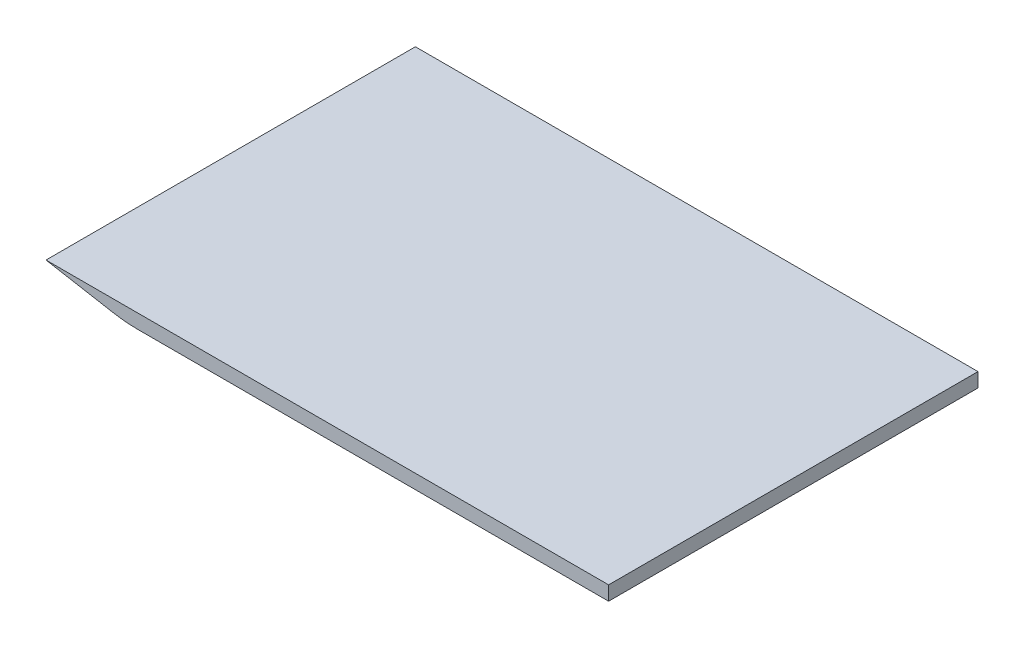
ISO-10303-21;
HEADER;
FILE_DESCRIPTION(('STEP AP214'),'2;1');
FILE_NAME('part.step','',(''),(''),'','','');
FILE_SCHEMA(('AUTOMOTIVE_DESIGN { 1 0 10303 214 1 1 1 1 }'));
ENDSEC;
DATA;
#1=APPLICATION_CONTEXT('core data for automotive mechanical design processes');
#2=APPLICATION_PROTOCOL_DEFINITION('international standard','automotive_design',2000,#1);
#3=PRODUCT_CONTEXT('',#1,'mechanical');
#4=PRODUCT('Part','Part','',(#3));
#5=PRODUCT_RELATED_PRODUCT_CATEGORY('part','',(#4));
#6=PRODUCT_DEFINITION_FORMATION('','',#4);
#7=PRODUCT_DEFINITION_CONTEXT('part definition',#1,'design');
#8=PRODUCT_DEFINITION('design','',#6,#7);
#9=PRODUCT_DEFINITION_SHAPE('','',#8);
#10=(LENGTH_UNIT() NAMED_UNIT(*) SI_UNIT(.MILLI.,.METRE.));
#11=(NAMED_UNIT(*) PLANE_ANGLE_UNIT() SI_UNIT($,.RADIAN.));
#12=(NAMED_UNIT(*) SI_UNIT($,.STERADIAN.) SOLID_ANGLE_UNIT());
#13=UNCERTAINTY_MEASURE_WITH_UNIT(LENGTH_MEASURE(1.E-05),#10,'distance_accuracy_value','');
#14=(GEOMETRIC_REPRESENTATION_CONTEXT(3) GLOBAL_UNCERTAINTY_ASSIGNED_CONTEXT((#13)) GLOBAL_UNIT_ASSIGNED_CONTEXT((#10,
#11,#12)) REPRESENTATION_CONTEXT('',''));
#15=CARTESIAN_POINT('',(0.,0.,0.));
#16=DIRECTION('',(0.,0.,1.));
#17=DIRECTION('',(1.,0.,0.));
#18=AXIS2_PLACEMENT_3D('',#15,#16,#17);
#19=CARTESIAN_POINT('',(198.,-5.,130.));
#20=DIRECTION('',(0.,-1.,0.));
#21=DIRECTION('',(1.,0.,0.));
#22=AXIS2_PLACEMENT_3D('',#19,#20,#21);
#23=PLANE('',#22);
#24=DIRECTION('',(-1.,0.,0.));
#25=VECTOR('',#24,1.);
#26=CARTESIAN_POINT('',(198.,-5.,130.));
#27=LINE('',#26,#25);
#28=CARTESIAN_POINT('',(198.,-5.,130.));
#29=VERTEX_POINT('',#28);
#30=CARTESIAN_POINT('',(32.4292530665578,-5.00000000000002,130.));
#31=VERTEX_POINT('',#30);
#32=EDGE_CURVE('E87',#29,#31,#27,.T.);
#33=ORIENTED_EDGE('',*,*,#32,.T.);
#34=DIRECTION('',(0.,0.,-1.));
#35=VECTOR('',#34,1.);
#36=CARTESIAN_POINT('',(32.4292530665578,-5.00000000000002,130.));
#37=LINE('',#36,#35);
#38=CARTESIAN_POINT('',(32.4292530665578,-5.00000000000002,0.));
#39=VERTEX_POINT('',#38);
#40=EDGE_CURVE('E115',#31,#39,#37,.T.);
#41=ORIENTED_EDGE('',*,*,#40,.T.);
#42=DIRECTION('',(-1.,0.,0.));
#43=VECTOR('',#42,1.);
#44=CARTESIAN_POINT('',(198.,-5.,0.));
#45=LINE('',#44,#43);
#46=CARTESIAN_POINT('',(198.,-5.,0.));
#47=VERTEX_POINT('',#46);
#48=EDGE_CURVE('E105',#47,#39,#45,.T.);
#49=ORIENTED_EDGE('',*,*,#48,.F.);
#50=DIRECTION('',(0.,0.,-1.));
#51=VECTOR('',#50,1.);
#52=CARTESIAN_POINT('',(198.,-5.,130.));
#53=LINE('',#52,#51);
#54=EDGE_CURVE('E113',#29,#47,#53,.T.);
#55=ORIENTED_EDGE('',*,*,#54,.F.);
#56=EDGE_LOOP('',(#33,#41,#49,#55));
#57=FACE_BOUND('',#56,.T.);
#58=ADVANCED_FACE('F35',(#57),#23,.T.);
#59=CARTESIAN_POINT('',(198.,0.,130.));
#60=DIRECTION('',(1.,0.,0.));
#61=DIRECTION('',(0.,0.,-1.));
#62=AXIS2_PLACEMENT_3D('',#59,#60,#61);
#63=PLANE('',#62);
#64=DIRECTION('',(0.,-1.,0.));
#65=VECTOR('',#64,1.);
#66=CARTESIAN_POINT('',(198.,0.,0.));
#67=LINE('',#66,#65);
#68=CARTESIAN_POINT('',(198.,0.,0.));
#69=VERTEX_POINT('',#68);
#70=EDGE_CURVE('E110',#69,#47,#67,.T.);
#71=ORIENTED_EDGE('',*,*,#70,.F.);
#72=DIRECTION('',(0.,0.,-1.));
#73=VECTOR('',#72,1.);
#74=CARTESIAN_POINT('',(198.,0.,130.));
#75=LINE('',#74,#73);
#76=CARTESIAN_POINT('',(198.,0.,130.));
#77=VERTEX_POINT('',#76);
#78=EDGE_CURVE('E95',#77,#69,#75,.T.);
#79=ORIENTED_EDGE('',*,*,#78,.F.);
#80=DIRECTION('',(0.,-1.,0.));
#81=VECTOR('',#80,1.);
#82=CARTESIAN_POINT('',(198.,0.,130.));
#83=LINE('',#82,#81);
#84=EDGE_CURVE('E96',#77,#29,#83,.T.);
#85=ORIENTED_EDGE('',*,*,#84,.T.);
#86=ORIENTED_EDGE('',*,*,#54,.T.);
#87=EDGE_LOOP('',(#71,#79,#85,#86));
#88=FACE_BOUND('',#87,.T.);
#89=ADVANCED_FACE('F127',(#88),#63,.T.);
#90=CARTESIAN_POINT('',(0.,0.,130.));
#91=DIRECTION('',(0.,1.,0.));
#92=DIRECTION('',(0.,0.,1.));
#93=AXIS2_PLACEMENT_3D('',#90,#91,#92);
#94=PLANE('',#93);
#95=DIRECTION('',(1.,0.,0.));
#96=VECTOR('',#95,1.);
#97=CARTESIAN_POINT('',(0.,0.,0.));
#98=LINE('',#97,#96);
#99=CARTESIAN_POINT('',(0.,0.,0.));
#100=VERTEX_POINT('',#99);
#101=EDGE_CURVE('E94',#100,#69,#98,.T.);
#102=ORIENTED_EDGE('',*,*,#101,.F.);
#103=DIRECTION('',(0.,0.,-1.));
#104=VECTOR('',#103,1.);
#105=CARTESIAN_POINT('',(0.,0.,130.));
#106=LINE('',#105,#104);
#107=CARTESIAN_POINT('',(0.,0.,130.));
#108=VERTEX_POINT('',#107);
#109=EDGE_CURVE('E81',#108,#100,#106,.T.);
#110=ORIENTED_EDGE('',*,*,#109,.F.);
#111=DIRECTION('',(1.,0.,0.));
#112=VECTOR('',#111,1.);
#113=CARTESIAN_POINT('',(0.,0.,130.));
#114=LINE('',#113,#112);
#115=EDGE_CURVE('E86',#108,#77,#114,.T.);
#116=ORIENTED_EDGE('',*,*,#115,.T.);
#117=ORIENTED_EDGE('',*,*,#78,.T.);
#118=EDGE_LOOP('',(#102,#110,#116,#117));
#119=FACE_BOUND('',#118,.T.);
#120=ADVANCED_FACE('F91',(#119),#94,.T.);
#121=CARTESIAN_POINT('',(28.,-5.00000000000002,130.));
#122=DIRECTION('',(-0.175790638483658,-0.984427575508482,0.));
#123=DIRECTION('',(0.984427575508482,-0.175790638483658,0.));
#124=AXIS2_PLACEMENT_3D('',#121,#122,#123);
#125=PLANE('',#124);
#126=DIRECTION('',(-0.984427575508482,0.175790638483658,0.));
#127=VECTOR('',#126,1.);
#128=CARTESIAN_POINT('',(28.,-5.00000000000002,0.));
#129=LINE('',#128,#127);
#130=CARTESIAN_POINT('',(23.6397211423749,-4.22137877542411,0.));
#131=VERTEX_POINT('',#130);
#132=EDGE_CURVE('E107',#131,#100,#129,.T.);
#133=ORIENTED_EDGE('',*,*,#132,.F.);
#134=DIRECTION('',(0.,0.,-1.));
#135=VECTOR('',#134,1.);
#136=CARTESIAN_POINT('',(23.6397211423749,-4.22137877542411,130.));
#137=LINE('',#136,#135);
#138=CARTESIAN_POINT('',(23.6397211423749,-4.22137877542411,130.));
#139=VERTEX_POINT('',#138);
#140=EDGE_CURVE('E43',#131,#139,#137,.F.);
#141=ORIENTED_EDGE('',*,*,#140,.T.);
#142=DIRECTION('',(-0.984427575508482,0.175790638483658,0.));
#143=VECTOR('',#142,1.);
#144=CARTESIAN_POINT('',(28.,-5.00000000000002,130.));
#145=LINE('',#144,#143);
#146=EDGE_CURVE('E78',#139,#108,#145,.T.);
#147=ORIENTED_EDGE('',*,*,#146,.T.);
#148=ORIENTED_EDGE('',*,*,#109,.T.);
#149=EDGE_LOOP('',(#133,#141,#147,#148));
#150=FACE_BOUND('',#149,.T.);
#151=ADVANCED_FACE('F80',(#150),#125,.T.);
#152=CARTESIAN_POINT('',(0.,0.,130.));
#153=DIRECTION('',(0.,0.,1.));
#154=DIRECTION('',(1.,0.,0.));
#155=AXIS2_PLACEMENT_3D('',#152,#153,#154);
#156=PLANE('',#155);
#157=ORIENTED_EDGE('',*,*,#146,.F.);
#158=CARTESIAN_POINT('',(32.4292530665578,45.,130.));
#159=DIRECTION('',(0.,0.,1.));
#160=DIRECTION('',(1.,0.,0.));
#161=AXIS2_PLACEMENT_3D('',#158,#159,#160);
#162=CIRCLE('',#161,50.);
#163=EDGE_CURVE('E11',#139,#31,#162,.T.);
#164=ORIENTED_EDGE('',*,*,#163,.T.);
#165=ORIENTED_EDGE('',*,*,#32,.F.);
#166=ORIENTED_EDGE('',*,*,#84,.F.);
#167=ORIENTED_EDGE('',*,*,#115,.F.);
#168=EDGE_LOOP('',(#157,#164,#165,#166,#167));
#169=FACE_BOUND('',#168,.T.);
#170=ADVANCED_FACE('F98',(#169),#156,.T.);
#171=CARTESIAN_POINT('',(0.,0.,0.));
#172=DIRECTION('',(0.,0.,1.));
#173=DIRECTION('',(1.,0.,0.));
#174=AXIS2_PLACEMENT_3D('',#171,#172,#173);
#175=PLANE('',#174);
#176=ORIENTED_EDGE('',*,*,#48,.T.);
#177=CARTESIAN_POINT('',(32.4292530665578,45.,0.));
#178=DIRECTION('',(0.,0.,1.));
#179=DIRECTION('',(1.,0.,0.));
#180=AXIS2_PLACEMENT_3D('',#177,#178,#179);
#181=CIRCLE('',#180,50.);
#182=EDGE_CURVE('E57',#39,#131,#181,.F.);
#183=ORIENTED_EDGE('',*,*,#182,.T.);
#184=ORIENTED_EDGE('',*,*,#132,.T.);
#185=ORIENTED_EDGE('',*,*,#101,.T.);
#186=ORIENTED_EDGE('',*,*,#70,.T.);
#187=EDGE_LOOP('',(#176,#183,#184,#185,#186));
#188=FACE_BOUND('',#187,.T.);
#189=ADVANCED_FACE('F124',(#188),#175,.F.);
#190=CARTESIAN_POINT('',(32.4292530665578,45.,130.));
#191=DIRECTION('',(0.,0.,-1.));
#192=DIRECTION('',(-1.,0.,0.));
#193=AXIS2_PLACEMENT_3D('',#190,#191,#192);
#194=CYLINDRICAL_SURFACE('',#193,50.);
#195=ORIENTED_EDGE('',*,*,#163,.F.);
#196=ORIENTED_EDGE('',*,*,#140,.F.);
#197=ORIENTED_EDGE('',*,*,#182,.F.);
#198=ORIENTED_EDGE('',*,*,#40,.F.);
#199=EDGE_LOOP('',(#195,#196,#197,#198));
#200=FACE_BOUND('',#199,.T.);
#201=ADVANCED_FACE('F37',(#200),#194,.T.);
#202=CLOSED_SHELL('',(#58,#89,#120,#151,#170,#189,#201));
#203=MANIFOLD_SOLID_BREP('B2',#202);
#204=ADVANCED_BREP_SHAPE_REPRESENTATION('',(#18,#203),#14);
#205=SHAPE_DEFINITION_REPRESENTATION(#9,#204);
ENDSEC;
END-ISO-10303-21;
